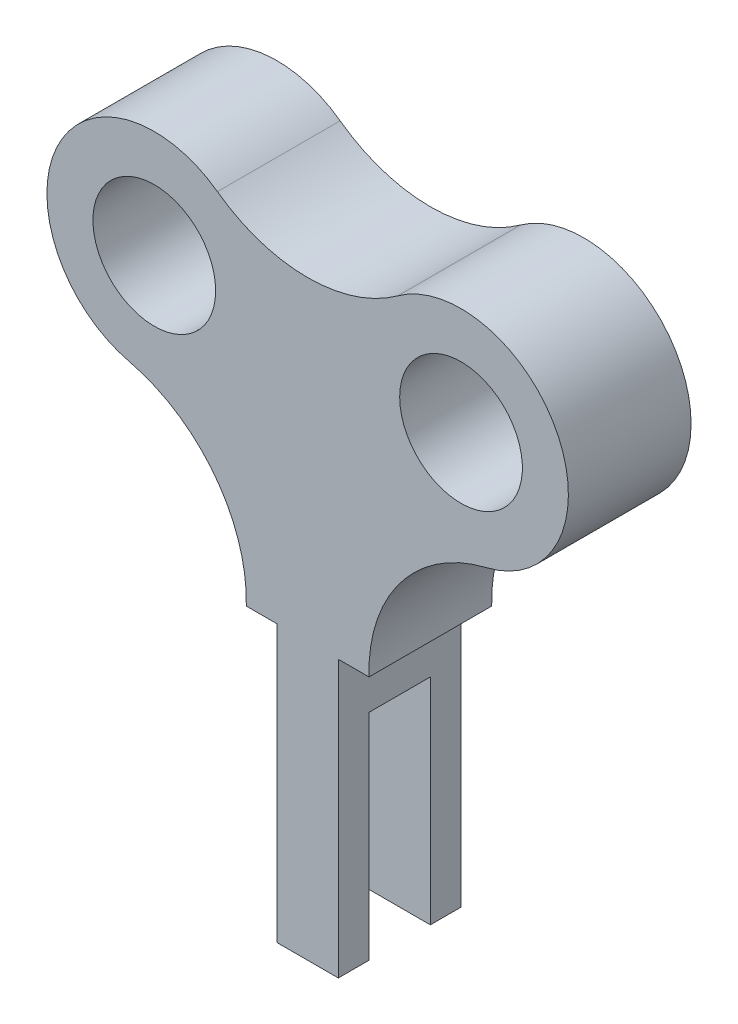
ISO-10303-21;
HEADER;
FILE_DESCRIPTION(('STEP AP214'),'2;1');
FILE_NAME('part.step','',(''),(''),'','','');
FILE_SCHEMA(('AUTOMOTIVE_DESIGN { 1 0 10303 214 1 1 1 1 }'));
ENDSEC;
DATA;
#1=APPLICATION_CONTEXT('core data for automotive mechanical design processes');
#2=APPLICATION_PROTOCOL_DEFINITION('international standard','automotive_design',2000,#1);
#3=PRODUCT_CONTEXT('',#1,'mechanical');
#4=PRODUCT('Part','Part','',(#3));
#5=PRODUCT_RELATED_PRODUCT_CATEGORY('part','',(#4));
#6=PRODUCT_DEFINITION_FORMATION('','',#4);
#7=PRODUCT_DEFINITION_CONTEXT('part definition',#1,'design');
#8=PRODUCT_DEFINITION('design','',#6,#7);
#9=PRODUCT_DEFINITION_SHAPE('','',#8);
#10=(LENGTH_UNIT() NAMED_UNIT(*) SI_UNIT(.MILLI.,.METRE.));
#11=(NAMED_UNIT(*) PLANE_ANGLE_UNIT() SI_UNIT($,.RADIAN.));
#12=(NAMED_UNIT(*) SI_UNIT($,.STERADIAN.) SOLID_ANGLE_UNIT());
#13=UNCERTAINTY_MEASURE_WITH_UNIT(LENGTH_MEASURE(1.E-05),#10,'distance_accuracy_value','');
#14=(GEOMETRIC_REPRESENTATION_CONTEXT(3) GLOBAL_UNCERTAINTY_ASSIGNED_CONTEXT((#13)) GLOBAL_UNIT_ASSIGNED_CONTEXT((#10,
#11,#12)) REPRESENTATION_CONTEXT('',''));
#15=CARTESIAN_POINT('',(0.,0.,0.));
#16=DIRECTION('',(0.,0.,1.));
#17=DIRECTION('',(1.,0.,0.));
#18=AXIS2_PLACEMENT_3D('',#15,#16,#17);
#19=CARTESIAN_POINT('',(-4.99999999999998,-53.1150652431791,20.));
#20=DIRECTION('',(0.,1.,0.));
#21=DIRECTION('',(-1.,0.,0.));
#22=AXIS2_PLACEMENT_3D('',#19,#20,#21);
#23=PLANE('',#22);
#24=DIRECTION('',(0.,0.,-1.));
#25=VECTOR('',#24,1.);
#26=CARTESIAN_POINT('',(-4.99999999999998,-53.1150652431791,20.));
#27=LINE('',#26,#25);
#28=CARTESIAN_POINT('',(-4.99999999999998,-53.1150652431791,20.));
#29=VERTEX_POINT('',#28);
#30=CARTESIAN_POINT('',(-4.99999999999998,-53.1150652431791,15.));
#31=VERTEX_POINT('',#30);
#32=EDGE_CURVE('E11',#29,#31,#27,.T.);
#33=ORIENTED_EDGE('',*,*,#32,.T.);
#34=DIRECTION('',(1.,0.,0.));
#35=VECTOR('',#34,1.);
#36=CARTESIAN_POINT('',(-4.99999999999998,-53.1150652431791,15.));
#37=LINE('',#36,#35);
#38=CARTESIAN_POINT('',(5.00000000000002,-53.1150652431791,15.));
#39=VERTEX_POINT('',#38);
#40=EDGE_CURVE('E247',#31,#39,#37,.T.);
#41=ORIENTED_EDGE('',*,*,#40,.T.);
#42=DIRECTION('',(0.,0.,-1.));
#43=VECTOR('',#42,1.);
#44=CARTESIAN_POINT('',(5.00000000000002,-53.1150652431791,20.));
#45=LINE('',#44,#43);
#46=CARTESIAN_POINT('',(5.00000000000002,-53.1150652431791,20.));
#47=VERTEX_POINT('',#46);
#48=EDGE_CURVE('E192',#47,#39,#45,.T.);
#49=ORIENTED_EDGE('',*,*,#48,.F.);
#50=DIRECTION('',(1.,0.,0.));
#51=VECTOR('',#50,1.);
#52=CARTESIAN_POINT('',(-4.99999999999998,-53.1150652431791,20.));
#53=LINE('',#52,#51);
#54=EDGE_CURVE('E104',#29,#47,#53,.T.);
#55=ORIENTED_EDGE('',*,*,#54,.F.);
#56=EDGE_LOOP('',(#33,#41,#49,#55));
#57=FACE_BOUND('',#56,.T.);
#58=ADVANCED_FACE('F33',(#57),#23,.F.);
#59=CARTESIAN_POINT('',(34.990451034251,-7.42415489826879,20.));
#60=DIRECTION('',(0.,0.,-1.));
#61=DIRECTION('',(-1.,0.,0.));
#62=AXIS2_PLACEMENT_3D('',#59,#60,#61);
#63=PLANE('',#62);
#64=DIRECTION('',(0.,-1.,0.));
#65=VECTOR('',#64,1.);
#66=CARTESIAN_POINT('',(-4.99999999999999,-8.11506524317914,20.));
#67=LINE('',#66,#65);
#68=CARTESIAN_POINT('',(-4.99999999999999,-8.11506524317914,20.));
#69=VERTEX_POINT('',#68);
#70=EDGE_CURVE('E176',#69,#29,#67,.T.);
#71=ORIENTED_EDGE('',*,*,#70,.T.);
#72=ORIENTED_EDGE('',*,*,#54,.T.);
#73=DIRECTION('',(0.,1.,0.));
#74=VECTOR('',#73,1.);
#75=CARTESIAN_POINT('',(5.00000000000001,-8.11506524317914,20.));
#76=LINE('',#75,#74);
#77=CARTESIAN_POINT('',(5.00000000000001,-8.11506524317914,20.));
#78=VERTEX_POINT('',#77);
#79=EDGE_CURVE('E229',#47,#78,#76,.T.);
#80=ORIENTED_EDGE('',*,*,#79,.T.);
#81=DIRECTION('',(1.,0.,0.));
#82=VECTOR('',#81,1.);
#83=CARTESIAN_POINT('',(5.00000000000001,-8.11506524317914,20.));
#84=LINE('',#83,#82);
#85=CARTESIAN_POINT('',(10.,-8.11506524317915,20.));
#86=VERTEX_POINT('',#85);
#87=EDGE_CURVE('E226',#78,#86,#84,.T.);
#88=ORIENTED_EDGE('',*,*,#87,.T.);
#89=CARTESIAN_POINT('',(34.990451034251,-7.42415489826879,20.));
#90=DIRECTION('',(0.,0.,-1.));
#91=DIRECTION('',(-1.,0.,0.));
#92=AXIS2_PLACEMENT_3D('',#89,#90,#91);
#93=CIRCLE('',#92,25.);
#94=CARTESIAN_POINT('',(29.1137151317504,16.8753096047251,20.));
#95=VERTEX_POINT('',#94);
#96=EDGE_CURVE('E223',#86,#95,#93,.T.);
#97=ORIENTED_EDGE('',*,*,#96,.T.);
#98=CARTESIAN_POINT('',(25.,33.8849347568208,20.));
#99=DIRECTION('',(0.,0.,1.));
#100=DIRECTION('',(-1.,0.,0.));
#101=AXIS2_PLACEMENT_3D('',#98,#99,#100);
#102=CIRCLE('',#101,17.5);
#103=CARTESIAN_POINT('',(14.7058823529412,48.0370067559492,20.));
#104=VERTEX_POINT('',#103);
#105=EDGE_CURVE('E225',#95,#104,#102,.T.);
#106=ORIENTED_EDGE('',*,*,#105,.T.);
#107=CARTESIAN_POINT('',(0.,68.2542524689896,20.));
#108=DIRECTION('',(0.,0.,-1.));
#109=DIRECTION('',(1.,0.,0.));
#110=AXIS2_PLACEMENT_3D('',#107,#108,#109);
#111=CIRCLE('',#110,25.);
#112=CARTESIAN_POINT('',(-14.7058823529412,48.0370067559492,20.));
#113=VERTEX_POINT('',#112);
#114=EDGE_CURVE('E134',#104,#113,#111,.T.);
#115=ORIENTED_EDGE('',*,*,#114,.T.);
#116=CARTESIAN_POINT('',(-25.,33.8849347568208,20.));
#117=DIRECTION('',(0.,0.,1.));
#118=DIRECTION('',(1.,0.,0.));
#119=AXIS2_PLACEMENT_3D('',#116,#117,#118);
#120=CIRCLE('',#119,17.5);
#121=CARTESIAN_POINT('',(-29.1137151317504,16.8753096047251,20.));
#122=VERTEX_POINT('',#121);
#123=EDGE_CURVE('E126',#113,#122,#120,.T.);
#124=ORIENTED_EDGE('',*,*,#123,.T.);
#125=CARTESIAN_POINT('',(-34.990451034251,-7.4241548982688,20.));
#126=DIRECTION('',(0.,0.,-1.));
#127=DIRECTION('',(1.,0.,0.));
#128=AXIS2_PLACEMENT_3D('',#125,#126,#127);
#129=CIRCLE('',#128,25.);
#130=CARTESIAN_POINT('',(-9.99999999999999,-8.11506524317914,20.));
#131=VERTEX_POINT('',#130);
#132=EDGE_CURVE('E131',#122,#131,#129,.T.);
#133=ORIENTED_EDGE('',*,*,#132,.T.);
#134=DIRECTION('',(1.,0.,0.));
#135=VECTOR('',#134,1.);
#136=CARTESIAN_POINT('',(-9.99999999999999,-8.11506524317914,20.));
#137=LINE('',#136,#135);
#138=EDGE_CURVE('E57',#131,#69,#137,.T.);
#139=ORIENTED_EDGE('',*,*,#138,.T.);
#140=EDGE_LOOP('',(#71,#72,#80,#88,#97,#106,#115,#124,#133,#139));
#141=FACE_BOUND('',#140,.T.);
#142=CARTESIAN_POINT('',(-25.,33.8849347568208,20.));
#143=DIRECTION('',(0.,0.,1.));
#144=DIRECTION('',(1.,0.,0.));
#145=AXIS2_PLACEMENT_3D('',#142,#143,#144);
#146=CIRCLE('',#145,10.);
#147=CARTESIAN_POINT('',(-15.,33.8849347568208,20.));
#148=VERTEX_POINT('',#147);
#149=EDGE_CURVE('E159',#148,#148,#146,.T.);
#150=ORIENTED_EDGE('',*,*,#149,.F.);
#151=EDGE_LOOP('',(#150));
#152=FACE_BOUND('',#151,.T.);
#153=CARTESIAN_POINT('',(25.,33.8849347568208,20.));
#154=DIRECTION('',(0.,0.,1.));
#155=DIRECTION('',(-1.,0.,0.));
#156=AXIS2_PLACEMENT_3D('',#153,#154,#155);
#157=CIRCLE('',#156,10.);
#158=CARTESIAN_POINT('',(15.,33.8849347568208,20.));
#159=VERTEX_POINT('',#158);
#160=EDGE_CURVE('E238',#159,#159,#157,.T.);
#161=ORIENTED_EDGE('',*,*,#160,.F.);
#162=EDGE_LOOP('',(#161));
#163=FACE_BOUND('',#162,.T.);
#164=ADVANCED_FACE('F128',(#141,#152,#163),#63,.F.);
#165=CARTESIAN_POINT('',(34.990451034251,-7.42415489826879,0.));
#166=DIRECTION('',(0.,0.,-1.));
#167=DIRECTION('',(-1.,0.,0.));
#168=AXIS2_PLACEMENT_3D('',#165,#166,#167);
#169=PLANE('',#168);
#170=CARTESIAN_POINT('',(-25.,33.8849347568208,0.));
#171=DIRECTION('',(0.,0.,1.));
#172=DIRECTION('',(1.,0.,0.));
#173=AXIS2_PLACEMENT_3D('',#170,#171,#172);
#174=CIRCLE('',#173,10.);
#175=CARTESIAN_POINT('',(-15.,33.8849347568208,0.));
#176=VERTEX_POINT('',#175);
#177=EDGE_CURVE('E235',#176,#176,#174,.T.);
#178=ORIENTED_EDGE('',*,*,#177,.T.);
#179=EDGE_LOOP('',(#178));
#180=FACE_BOUND('',#179,.T.);
#181=DIRECTION('',(0.,-1.,0.));
#182=VECTOR('',#181,1.);
#183=CARTESIAN_POINT('',(-4.99999999999999,-8.11506524317914,0.));
#184=LINE('',#183,#182);
#185=CARTESIAN_POINT('',(-4.99999999999999,-8.11506524317914,0.));
#186=VERTEX_POINT('',#185);
#187=CARTESIAN_POINT('',(-4.99999999999998,-53.1150652431791,0.));
#188=VERTEX_POINT('',#187);
#189=EDGE_CURVE('E155',#186,#188,#184,.T.);
#190=ORIENTED_EDGE('',*,*,#189,.F.);
#191=DIRECTION('',(1.,0.,0.));
#192=VECTOR('',#191,1.);
#193=CARTESIAN_POINT('',(-9.99999999999999,-8.11506524317914,0.));
#194=LINE('',#193,#192);
#195=CARTESIAN_POINT('',(-9.99999999999999,-8.11506524317914,0.));
#196=VERTEX_POINT('',#195);
#197=EDGE_CURVE('E96',#196,#186,#194,.T.);
#198=ORIENTED_EDGE('',*,*,#197,.F.);
#199=CARTESIAN_POINT('',(-34.990451034251,-7.4241548982688,0.));
#200=DIRECTION('',(0.,0.,-1.));
#201=DIRECTION('',(1.,0.,0.));
#202=AXIS2_PLACEMENT_3D('',#199,#200,#201);
#203=CIRCLE('',#202,25.);
#204=CARTESIAN_POINT('',(-29.1137151317504,16.8753096047251,0.));
#205=VERTEX_POINT('',#204);
#206=EDGE_CURVE('E173',#205,#196,#203,.T.);
#207=ORIENTED_EDGE('',*,*,#206,.F.);
#208=CARTESIAN_POINT('',(-25.,33.8849347568208,0.));
#209=DIRECTION('',(0.,0.,1.));
#210=DIRECTION('',(1.,0.,0.));
#211=AXIS2_PLACEMENT_3D('',#208,#209,#210);
#212=CIRCLE('',#211,17.5);
#213=CARTESIAN_POINT('',(-14.7058823529412,48.0370067559492,0.));
#214=VERTEX_POINT('',#213);
#215=EDGE_CURVE('E143',#214,#205,#212,.T.);
#216=ORIENTED_EDGE('',*,*,#215,.F.);
#217=CARTESIAN_POINT('',(0.,68.2542524689896,0.));
#218=DIRECTION('',(0.,0.,-1.));
#219=DIRECTION('',(1.,0.,0.));
#220=AXIS2_PLACEMENT_3D('',#217,#218,#219);
#221=CIRCLE('',#220,25.);
#222=CARTESIAN_POINT('',(14.7058823529412,48.0370067559492,0.));
#223=VERTEX_POINT('',#222);
#224=EDGE_CURVE('E170',#223,#214,#221,.T.);
#225=ORIENTED_EDGE('',*,*,#224,.F.);
#226=CARTESIAN_POINT('',(25.,33.8849347568208,0.));
#227=DIRECTION('',(0.,0.,1.));
#228=DIRECTION('',(-1.,0.,0.));
#229=AXIS2_PLACEMENT_3D('',#226,#227,#228);
#230=CIRCLE('',#229,17.5);
#231=CARTESIAN_POINT('',(29.1137151317504,16.8753096047251,0.));
#232=VERTEX_POINT('',#231);
#233=EDGE_CURVE('E168',#232,#223,#230,.T.);
#234=ORIENTED_EDGE('',*,*,#233,.F.);
#235=CARTESIAN_POINT('',(34.990451034251,-7.42415489826879,0.));
#236=DIRECTION('',(0.,0.,-1.));
#237=DIRECTION('',(-1.,0.,0.));
#238=AXIS2_PLACEMENT_3D('',#235,#236,#237);
#239=CIRCLE('',#238,25.);
#240=CARTESIAN_POINT('',(10.,-8.11506524317915,0.));
#241=VERTEX_POINT('',#240);
#242=EDGE_CURVE('E166',#241,#232,#239,.T.);
#243=ORIENTED_EDGE('',*,*,#242,.F.);
#244=DIRECTION('',(1.,0.,0.));
#245=VECTOR('',#244,1.);
#246=CARTESIAN_POINT('',(5.00000000000001,-8.11506524317914,0.));
#247=LINE('',#246,#245);
#248=CARTESIAN_POINT('',(5.00000000000001,-8.11506524317914,0.));
#249=VERTEX_POINT('',#248);
#250=EDGE_CURVE('E164',#249,#241,#247,.T.);
#251=ORIENTED_EDGE('',*,*,#250,.F.);
#252=DIRECTION('',(0.,1.,0.));
#253=VECTOR('',#252,1.);
#254=CARTESIAN_POINT('',(5.00000000000001,-8.11506524317914,0.));
#255=LINE('',#254,#253);
#256=CARTESIAN_POINT('',(5.00000000000002,-53.1150652431791,0.));
#257=VERTEX_POINT('',#256);
#258=EDGE_CURVE('E162',#257,#249,#255,.T.);
#259=ORIENTED_EDGE('',*,*,#258,.F.);
#260=DIRECTION('',(1.,0.,0.));
#261=VECTOR('',#260,1.);
#262=CARTESIAN_POINT('',(-4.99999999999998,-53.1150652431791,0.));
#263=LINE('',#262,#261);
#264=EDGE_CURVE('E158',#188,#257,#263,.T.);
#265=ORIENTED_EDGE('',*,*,#264,.F.);
#266=EDGE_LOOP('',(#190,#198,#207,#216,#225,#234,#243,#251,#259,#265));
#267=FACE_BOUND('',#266,.T.);
#268=CARTESIAN_POINT('',(25.,33.8849347568208,0.));
#269=DIRECTION('',(0.,0.,1.));
#270=DIRECTION('',(-1.,0.,0.));
#271=AXIS2_PLACEMENT_3D('',#268,#269,#270);
#272=CIRCLE('',#271,10.);
#273=CARTESIAN_POINT('',(15.,33.8849347568208,0.));
#274=VERTEX_POINT('',#273);
#275=EDGE_CURVE('E241',#274,#274,#272,.T.);
#276=ORIENTED_EDGE('',*,*,#275,.T.);
#277=EDGE_LOOP('',(#276));
#278=FACE_BOUND('',#277,.T.);
#279=ADVANCED_FACE('F211',(#180,#267,#278),#169,.T.);
#280=CARTESIAN_POINT('',(-4.99999999999999,-8.11506524317914,20.));
#281=DIRECTION('',(1.,0.,0.));
#282=DIRECTION('',(0.,1.,0.));
#283=AXIS2_PLACEMENT_3D('',#280,#281,#282);
#284=PLANE('',#283);
#285=DIRECTION('',(0.,0.,1.));
#286=VECTOR('',#285,1.);
#287=CARTESIAN_POINT('',(-4.99999999999999,-18.1150652431791,15.));
#288=LINE('',#287,#286);
#289=CARTESIAN_POINT('',(-4.99999999999999,-18.1150652431791,5.));
#290=VERTEX_POINT('',#289);
#291=CARTESIAN_POINT('',(-4.99999999999999,-18.1150652431791,15.));
#292=VERTEX_POINT('',#291);
#293=EDGE_CURVE('E250',#290,#292,#288,.T.);
#294=ORIENTED_EDGE('',*,*,#293,.T.);
#295=DIRECTION('',(0.,-1.,0.));
#296=VECTOR('',#295,1.);
#297=CARTESIAN_POINT('',(-4.99999999999998,-53.1150652431791,15.));
#298=LINE('',#297,#296);
#299=EDGE_CURVE('E260',#292,#31,#298,.T.);
#300=ORIENTED_EDGE('',*,*,#299,.T.);
#301=ORIENTED_EDGE('',*,*,#32,.F.);
#302=ORIENTED_EDGE('',*,*,#70,.F.);
#303=DIRECTION('',(0.,0.,-1.));
#304=VECTOR('',#303,1.);
#305=CARTESIAN_POINT('',(-4.99999999999999,-8.11506524317914,20.));
#306=LINE('',#305,#304);
#307=EDGE_CURVE('E151',#69,#186,#306,.T.);
#308=ORIENTED_EDGE('',*,*,#307,.T.);
#309=ORIENTED_EDGE('',*,*,#189,.T.);
#310=CARTESIAN_POINT('',(-4.99999999999998,-53.1150652431791,5.));
#311=VERTEX_POINT('',#310);
#312=EDGE_CURVE('E41',#311,#188,#27,.T.);
#313=ORIENTED_EDGE('',*,*,#312,.F.);
#314=DIRECTION('',(0.,1.,0.));
#315=VECTOR('',#314,1.);
#316=CARTESIAN_POINT('',(-4.99999999999998,-53.1150652431791,5.));
#317=LINE('',#316,#315);
#318=EDGE_CURVE('E267',#311,#290,#317,.T.);
#319=ORIENTED_EDGE('',*,*,#318,.T.);
#320=EDGE_LOOP('',(#294,#300,#301,#302,#308,#309,#313,#319));
#321=FACE_BOUND('',#320,.T.);
#322=ADVANCED_FACE('F35',(#321),#284,.F.);
#323=CARTESIAN_POINT('',(5.00000000000002,-53.1150652431791,5.));
#324=VERTEX_POINT('',#323);
#325=EDGE_CURVE('E191',#324,#257,#45,.T.);
#326=ORIENTED_EDGE('',*,*,#325,.F.);
#327=DIRECTION('',(1.,0.,0.));
#328=VECTOR('',#327,1.);
#329=CARTESIAN_POINT('',(-4.99999999999998,-53.1150652431791,5.));
#330=LINE('',#329,#328);
#331=EDGE_CURVE('E48',#311,#324,#330,.T.);
#332=ORIENTED_EDGE('',*,*,#331,.F.);
#333=ORIENTED_EDGE('',*,*,#312,.T.);
#334=ORIENTED_EDGE('',*,*,#264,.T.);
#335=EDGE_LOOP('',(#326,#332,#333,#334));
#336=FACE_BOUND('',#335,.T.);
#337=ADVANCED_FACE('F206',(#336),#23,.F.);
#338=CARTESIAN_POINT('',(5.00000000000001,-8.11506524317914,20.));
#339=DIRECTION('',(-1.,0.,0.));
#340=DIRECTION('',(0.,-1.,0.));
#341=AXIS2_PLACEMENT_3D('',#338,#339,#340);
#342=PLANE('',#341);
#343=ORIENTED_EDGE('',*,*,#48,.T.);
#344=DIRECTION('',(0.,-1.,0.));
#345=VECTOR('',#344,1.);
#346=CARTESIAN_POINT('',(5.00000000000002,-53.1150652431791,15.));
#347=LINE('',#346,#345);
#348=CARTESIAN_POINT('',(5.00000000000001,-18.1150652431791,15.));
#349=VERTEX_POINT('',#348);
#350=EDGE_CURVE('E262',#349,#39,#347,.T.);
#351=ORIENTED_EDGE('',*,*,#350,.F.);
#352=DIRECTION('',(0.,0.,1.));
#353=VECTOR('',#352,1.);
#354=CARTESIAN_POINT('',(5.00000000000001,-18.1150652431791,15.));
#355=LINE('',#354,#353);
#356=CARTESIAN_POINT('',(5.00000000000001,-18.1150652431791,5.));
#357=VERTEX_POINT('',#356);
#358=EDGE_CURVE('E257',#357,#349,#355,.T.);
#359=ORIENTED_EDGE('',*,*,#358,.F.);
#360=DIRECTION('',(0.,1.,0.));
#361=VECTOR('',#360,1.);
#362=CARTESIAN_POINT('',(5.00000000000002,-53.1150652431791,5.));
#363=LINE('',#362,#361);
#364=EDGE_CURVE('E203',#324,#357,#363,.T.);
#365=ORIENTED_EDGE('',*,*,#364,.F.);
#366=ORIENTED_EDGE('',*,*,#325,.T.);
#367=ORIENTED_EDGE('',*,*,#258,.T.);
#368=DIRECTION('',(0.,0.,-1.));
#369=VECTOR('',#368,1.);
#370=CARTESIAN_POINT('',(5.00000000000001,-8.11506524317914,20.));
#371=LINE('',#370,#369);
#372=EDGE_CURVE('E189',#78,#249,#371,.T.);
#373=ORIENTED_EDGE('',*,*,#372,.F.);
#374=ORIENTED_EDGE('',*,*,#79,.F.);
#375=EDGE_LOOP('',(#343,#351,#359,#365,#366,#367,#373,#374));
#376=FACE_BOUND('',#375,.T.);
#377=ADVANCED_FACE('F199',(#376),#342,.F.);
#378=CARTESIAN_POINT('',(5.00000000000001,-8.11506524317914,20.));
#379=DIRECTION('',(0.,1.,0.));
#380=DIRECTION('',(0.,0.,1.));
#381=AXIS2_PLACEMENT_3D('',#378,#379,#380);
#382=PLANE('',#381);
#383=ORIENTED_EDGE('',*,*,#250,.T.);
#384=DIRECTION('',(0.,0.,-1.));
#385=VECTOR('',#384,1.);
#386=CARTESIAN_POINT('',(10.,-8.11506524317915,20.));
#387=LINE('',#386,#385);
#388=EDGE_CURVE('E186',#86,#241,#387,.T.);
#389=ORIENTED_EDGE('',*,*,#388,.F.);
#390=ORIENTED_EDGE('',*,*,#87,.F.);
#391=ORIENTED_EDGE('',*,*,#372,.T.);
#392=EDGE_LOOP('',(#383,#389,#390,#391));
#393=FACE_BOUND('',#392,.T.);
#394=ADVANCED_FACE('F217',(#393),#382,.F.);
#395=CARTESIAN_POINT('',(34.990451034251,-7.42415489826879,20.));
#396=DIRECTION('',(0.,0.,-1.));
#397=DIRECTION('',(-1.,0.,0.));
#398=AXIS2_PLACEMENT_3D('',#395,#396,#397);
#399=CYLINDRICAL_SURFACE('',#398,25.);
#400=ORIENTED_EDGE('',*,*,#242,.T.);
#401=DIRECTION('',(0.,0.,-1.));
#402=VECTOR('',#401,1.);
#403=CARTESIAN_POINT('',(29.1137151317504,16.8753096047251,20.));
#404=LINE('',#403,#402);
#405=EDGE_CURVE('E183',#95,#232,#404,.T.);
#406=ORIENTED_EDGE('',*,*,#405,.F.);
#407=ORIENTED_EDGE('',*,*,#96,.F.);
#408=ORIENTED_EDGE('',*,*,#388,.T.);
#409=EDGE_LOOP('',(#400,#406,#407,#408));
#410=FACE_BOUND('',#409,.T.);
#411=ADVANCED_FACE('F221',(#410),#399,.F.);
#412=CARTESIAN_POINT('',(25.,33.8849347568208,20.));
#413=DIRECTION('',(0.,0.,-1.));
#414=DIRECTION('',(-1.,0.,0.));
#415=AXIS2_PLACEMENT_3D('',#412,#413,#414);
#416=CYLINDRICAL_SURFACE('',#415,17.5);
#417=ORIENTED_EDGE('',*,*,#233,.T.);
#418=DIRECTION('',(0.,0.,-1.));
#419=VECTOR('',#418,1.);
#420=CARTESIAN_POINT('',(14.7058823529412,48.0370067559492,20.));
#421=LINE('',#420,#419);
#422=EDGE_CURVE('E180',#104,#223,#421,.T.);
#423=ORIENTED_EDGE('',*,*,#422,.F.);
#424=ORIENTED_EDGE('',*,*,#105,.F.);
#425=ORIENTED_EDGE('',*,*,#405,.T.);
#426=EDGE_LOOP('',(#417,#423,#424,#425));
#427=FACE_BOUND('',#426,.T.);
#428=ADVANCED_FACE('F389',(#427),#416,.T.);
#429=CARTESIAN_POINT('',(0.,68.2542524689896,20.));
#430=DIRECTION('',(0.,0.,-1.));
#431=DIRECTION('',(-1.,0.,0.));
#432=AXIS2_PLACEMENT_3D('',#429,#430,#431);
#433=CYLINDRICAL_SURFACE('',#432,25.);
#434=ORIENTED_EDGE('',*,*,#224,.T.);
#435=DIRECTION('',(0.,0.,-1.));
#436=VECTOR('',#435,1.);
#437=CARTESIAN_POINT('',(-14.7058823529412,48.0370067559492,20.));
#438=LINE('',#437,#436);
#439=EDGE_CURVE('E146',#113,#214,#438,.T.);
#440=ORIENTED_EDGE('',*,*,#439,.F.);
#441=ORIENTED_EDGE('',*,*,#114,.F.);
#442=ORIENTED_EDGE('',*,*,#422,.T.);
#443=EDGE_LOOP('',(#434,#440,#441,#442));
#444=FACE_BOUND('',#443,.T.);
#445=ADVANCED_FACE('F381',(#444),#433,.F.);
#446=CARTESIAN_POINT('',(-25.,33.8849347568208,20.));
#447=DIRECTION('',(0.,0.,-1.));
#448=DIRECTION('',(-1.,0.,0.));
#449=AXIS2_PLACEMENT_3D('',#446,#447,#448);
#450=CYLINDRICAL_SURFACE('',#449,17.5);
#451=ORIENTED_EDGE('',*,*,#215,.T.);
#452=DIRECTION('',(0.,0.,-1.));
#453=VECTOR('',#452,1.);
#454=CARTESIAN_POINT('',(-29.1137151317504,16.8753096047251,20.));
#455=LINE('',#454,#453);
#456=EDGE_CURVE('E140',#122,#205,#455,.T.);
#457=ORIENTED_EDGE('',*,*,#456,.F.);
#458=ORIENTED_EDGE('',*,*,#123,.F.);
#459=ORIENTED_EDGE('',*,*,#439,.T.);
#460=EDGE_LOOP('',(#451,#457,#458,#459));
#461=FACE_BOUND('',#460,.T.);
#462=ADVANCED_FACE('F141',(#461),#450,.T.);
#463=CARTESIAN_POINT('',(-34.990451034251,-7.4241548982688,20.));
#464=DIRECTION('',(0.,0.,-1.));
#465=DIRECTION('',(-1.,0.,0.));
#466=AXIS2_PLACEMENT_3D('',#463,#464,#465);
#467=CYLINDRICAL_SURFACE('',#466,25.);
#468=ORIENTED_EDGE('',*,*,#206,.T.);
#469=DIRECTION('',(0.,0.,-1.));
#470=VECTOR('',#469,1.);
#471=CARTESIAN_POINT('',(-9.99999999999999,-8.11506524317914,20.));
#472=LINE('',#471,#470);
#473=EDGE_CURVE('E147',#131,#196,#472,.T.);
#474=ORIENTED_EDGE('',*,*,#473,.F.);
#475=ORIENTED_EDGE('',*,*,#132,.F.);
#476=ORIENTED_EDGE('',*,*,#456,.T.);
#477=EDGE_LOOP('',(#468,#474,#475,#476));
#478=FACE_BOUND('',#477,.T.);
#479=ADVANCED_FACE('F149',(#478),#467,.F.);
#480=CARTESIAN_POINT('',(-9.99999999999999,-8.11506524317914,20.));
#481=DIRECTION('',(0.,1.,0.));
#482=DIRECTION('',(-1.,0.,0.));
#483=AXIS2_PLACEMENT_3D('',#480,#481,#482);
#484=PLANE('',#483);
#485=ORIENTED_EDGE('',*,*,#197,.T.);
#486=ORIENTED_EDGE('',*,*,#307,.F.);
#487=ORIENTED_EDGE('',*,*,#138,.F.);
#488=ORIENTED_EDGE('',*,*,#473,.T.);
#489=EDGE_LOOP('',(#485,#486,#487,#488));
#490=FACE_BOUND('',#489,.T.);
#491=ADVANCED_FACE('F293',(#490),#484,.F.);
#492=CARTESIAN_POINT('',(-25.,33.8849347568208,20.));
#493=DIRECTION('',(0.,0.,-1.));
#494=DIRECTION('',(-1.,0.,0.));
#495=AXIS2_PLACEMENT_3D('',#492,#493,#494);
#496=CYLINDRICAL_SURFACE('',#495,10.);
#497=ORIENTED_EDGE('',*,*,#149,.T.);
#498=EDGE_LOOP('',(#497));
#499=FACE_BOUND('',#498,.T.);
#500=ORIENTED_EDGE('',*,*,#177,.F.);
#501=EDGE_LOOP('',(#500));
#502=FACE_BOUND('',#501,.T.);
#503=ADVANCED_FACE('F295',(#499,#502),#496,.F.);
#504=CARTESIAN_POINT('',(25.,33.8849347568208,20.));
#505=DIRECTION('',(0.,0.,-1.));
#506=DIRECTION('',(-1.,0.,0.));
#507=AXIS2_PLACEMENT_3D('',#504,#505,#506);
#508=CYLINDRICAL_SURFACE('',#507,10.);
#509=ORIENTED_EDGE('',*,*,#160,.T.);
#510=EDGE_LOOP('',(#509));
#511=FACE_BOUND('',#510,.T.);
#512=ORIENTED_EDGE('',*,*,#275,.F.);
#513=EDGE_LOOP('',(#512));
#514=FACE_BOUND('',#513,.T.);
#515=ADVANCED_FACE('F301',(#511,#514),#508,.F.);
#516=CARTESIAN_POINT('',(-4.99999999999998,-53.1150652431791,15.));
#517=DIRECTION('',(0.,0.,1.));
#518=DIRECTION('',(1.,0.,0.));
#519=AXIS2_PLACEMENT_3D('',#516,#517,#518);
#520=PLANE('',#519);
#521=ORIENTED_EDGE('',*,*,#350,.T.);
#522=ORIENTED_EDGE('',*,*,#40,.F.);
#523=ORIENTED_EDGE('',*,*,#299,.F.);
#524=DIRECTION('',(1.,0.,0.));
#525=VECTOR('',#524,1.);
#526=CARTESIAN_POINT('',(-4.99999999999999,-18.1150652431791,15.));
#527=LINE('',#526,#525);
#528=EDGE_CURVE('E244',#292,#349,#527,.T.);
#529=ORIENTED_EDGE('',*,*,#528,.T.);
#530=EDGE_LOOP('',(#521,#522,#523,#529));
#531=FACE_BOUND('',#530,.T.);
#532=ADVANCED_FACE('F283',(#531),#520,.F.);
#533=CARTESIAN_POINT('',(-4.99999999999999,-18.1150652431791,15.));
#534=DIRECTION('',(0.,1.,0.));
#535=DIRECTION('',(-1.,0.,0.));
#536=AXIS2_PLACEMENT_3D('',#533,#534,#535);
#537=PLANE('',#536);
#538=ORIENTED_EDGE('',*,*,#358,.T.);
#539=ORIENTED_EDGE('',*,*,#528,.F.);
#540=ORIENTED_EDGE('',*,*,#293,.F.);
#541=DIRECTION('',(1.,0.,0.));
#542=VECTOR('',#541,1.);
#543=CARTESIAN_POINT('',(-4.99999999999999,-18.1150652431791,5.));
#544=LINE('',#543,#542);
#545=EDGE_CURVE('E252',#290,#357,#544,.T.);
#546=ORIENTED_EDGE('',*,*,#545,.T.);
#547=EDGE_LOOP('',(#538,#539,#540,#546));
#548=FACE_BOUND('',#547,.T.);
#549=ADVANCED_FACE('F329',(#548),#537,.F.);
#550=CARTESIAN_POINT('',(-4.99999999999998,-53.1150652431791,5.));
#551=DIRECTION('',(0.,0.,-1.));
#552=DIRECTION('',(-1.,0.,0.));
#553=AXIS2_PLACEMENT_3D('',#550,#551,#552);
#554=PLANE('',#553);
#555=ORIENTED_EDGE('',*,*,#364,.T.);
#556=ORIENTED_EDGE('',*,*,#545,.F.);
#557=ORIENTED_EDGE('',*,*,#318,.F.);
#558=ORIENTED_EDGE('',*,*,#331,.T.);
#559=EDGE_LOOP('',(#555,#556,#557,#558));
#560=FACE_BOUND('',#559,.T.);
#561=ADVANCED_FACE('F291',(#560),#554,.F.);
#562=CLOSED_SHELL('',(#58,#164,#279,#322,#337,#377,#394,#411,#428,#445,#462,#479,#491,#503,#515,
#532,#549,#561));
#563=MANIFOLD_SOLID_BREP('B2',#562);
#564=ADVANCED_BREP_SHAPE_REPRESENTATION('',(#18,#563),#14);
#565=SHAPE_DEFINITION_REPRESENTATION(#9,#564);
ENDSEC;
END-ISO-10303-21;
